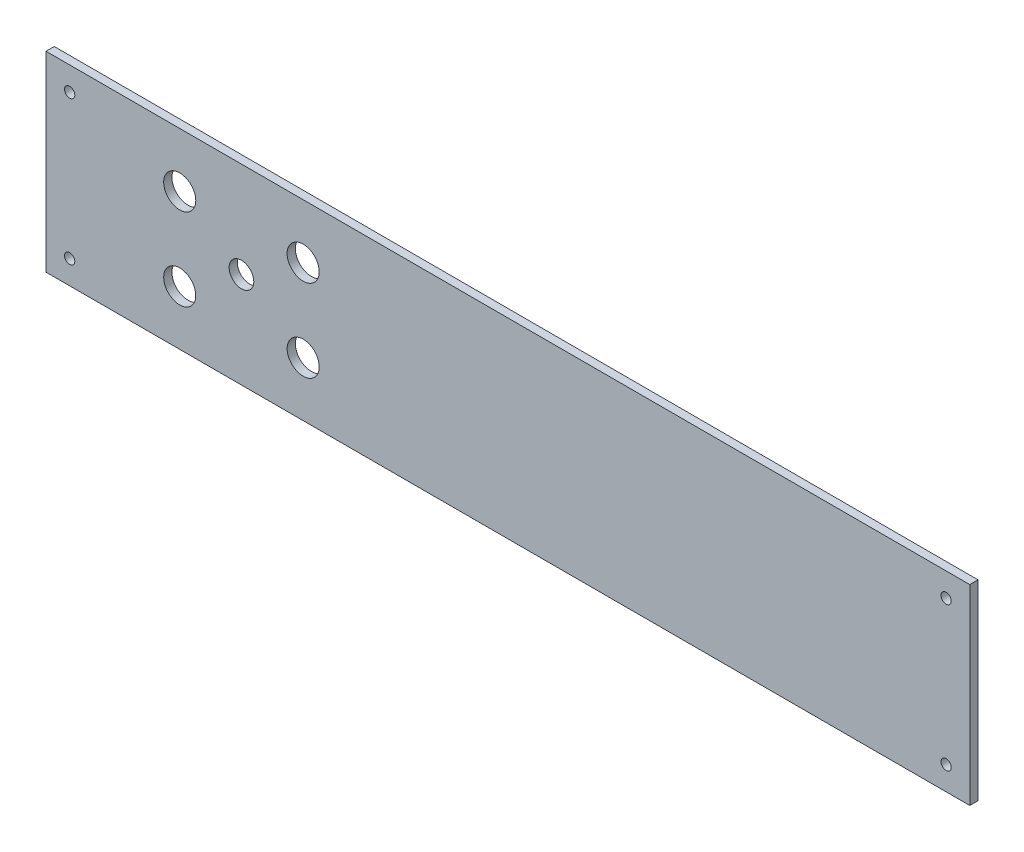
ISO-10303-21;
HEADER;
FILE_DESCRIPTION(('STEP AP214'),'2;1');
FILE_NAME('part.step','',(''),(''),'','','');
FILE_SCHEMA(('AUTOMOTIVE_DESIGN { 1 0 10303 214 1 1 1 1 }'));
ENDSEC;
DATA;
#1=APPLICATION_CONTEXT('core data for automotive mechanical design processes');
#2=APPLICATION_PROTOCOL_DEFINITION('international standard','automotive_design',2000,#1);
#3=PRODUCT_CONTEXT('',#1,'mechanical');
#4=PRODUCT('Part','Part','',(#3));
#5=PRODUCT_RELATED_PRODUCT_CATEGORY('part','',(#4));
#6=PRODUCT_DEFINITION_FORMATION('','',#4);
#7=PRODUCT_DEFINITION_CONTEXT('part definition',#1,'design');
#8=PRODUCT_DEFINITION('design','',#6,#7);
#9=PRODUCT_DEFINITION_SHAPE('','',#8);
#10=(LENGTH_UNIT() NAMED_UNIT(*) SI_UNIT(.MILLI.,.METRE.));
#11=(NAMED_UNIT(*) PLANE_ANGLE_UNIT() SI_UNIT($,.RADIAN.));
#12=(NAMED_UNIT(*) SI_UNIT($,.STERADIAN.) SOLID_ANGLE_UNIT());
#13=UNCERTAINTY_MEASURE_WITH_UNIT(LENGTH_MEASURE(1.E-05),#10,'distance_accuracy_value','');
#14=(GEOMETRIC_REPRESENTATION_CONTEXT(3) GLOBAL_UNCERTAINTY_ASSIGNED_CONTEXT((#13)) GLOBAL_UNIT_ASSIGNED_CONTEXT((#10,
#11,#12)) REPRESENTATION_CONTEXT('',''));
#15=CARTESIAN_POINT('',(0.,0.,0.));
#16=DIRECTION('',(0.,0.,1.));
#17=DIRECTION('',(1.,0.,0.));
#18=AXIS2_PLACEMENT_3D('',#15,#16,#17);
#19=CARTESIAN_POINT('',(0.,0.,4.));
#20=DIRECTION('',(0.,0.,1.));
#21=DIRECTION('',(1.,0.,0.));
#22=AXIS2_PLACEMENT_3D('',#19,#20,#21);
#23=PLANE('',#22);
#24=CARTESIAN_POINT('',(-324.,66.4999999999999,4.));
#25=DIRECTION('',(0.,0.,1.));
#26=DIRECTION('',(-1.,0.,0.));
#27=AXIS2_PLACEMENT_3D('',#24,#25,#26);
#28=CIRCLE('',#27,7.79999999999999);
#29=CARTESIAN_POINT('',(-331.8,66.4999999999999,4.));
#30=VERTEX_POINT('',#29);
#31=EDGE_CURVE('E191',#30,#30,#28,.T.);
#32=ORIENTED_EDGE('',*,*,#31,.F.);
#33=EDGE_LOOP('',(#32));
#34=FACE_BOUND('',#33,.T.);
#35=CARTESIAN_POINT('',(-324.,26.4999999999999,4.));
#36=DIRECTION('',(0.,0.,1.));
#37=DIRECTION('',(1.,0.,0.));
#38=AXIS2_PLACEMENT_3D('',#35,#36,#37);
#39=CIRCLE('',#38,7.79999999999999);
#40=CARTESIAN_POINT('',(-316.2,26.4999999999999,4.));
#41=VERTEX_POINT('',#40);
#42=EDGE_CURVE('E170',#41,#41,#39,.T.);
#43=ORIENTED_EDGE('',*,*,#42,.F.);
#44=EDGE_LOOP('',(#43));
#45=FACE_BOUND('',#44,.T.);
#46=CARTESIAN_POINT('',(-11.5,11.5000000000001,4.));
#47=DIRECTION('',(0.,0.,1.));
#48=DIRECTION('',(1.,0.,0.));
#49=AXIS2_PLACEMENT_3D('',#46,#47,#48);
#50=CIRCLE('',#49,2.50000000000002);
#51=CARTESIAN_POINT('',(-8.99999999999993,11.5000000000001,4.));
#52=VERTEX_POINT('',#51);
#53=EDGE_CURVE('E144',#52,#52,#50,.T.);
#54=ORIENTED_EDGE('',*,*,#53,.F.);
#55=EDGE_LOOP('',(#54));
#56=FACE_BOUND('',#55,.T.);
#57=CARTESIAN_POINT('',(-384.,26.4999999999999,4.));
#58=DIRECTION('',(0.,0.,1.));
#59=DIRECTION('',(-1.,0.,0.));
#60=AXIS2_PLACEMENT_3D('',#57,#58,#59);
#61=CIRCLE('',#60,7.79999999999999);
#62=CARTESIAN_POINT('',(-391.8,26.4999999999999,4.));
#63=VERTEX_POINT('',#62);
#64=EDGE_CURVE('E128',#63,#63,#61,.T.);
#65=ORIENTED_EDGE('',*,*,#64,.F.);
#66=EDGE_LOOP('',(#65));
#67=FACE_BOUND('',#66,.T.);
#68=DIRECTION('',(0.,1.,0.));
#69=VECTOR('',#68,1.);
#70=CARTESIAN_POINT('',(0.,0.,4.));
#71=LINE('',#70,#69);
#72=CARTESIAN_POINT('',(0.,0.,4.));
#73=VERTEX_POINT('',#72);
#74=CARTESIAN_POINT('',(0.,92.9999999999999,4.));
#75=VERTEX_POINT('',#74);
#76=EDGE_CURVE('E92',#73,#75,#71,.T.);
#77=ORIENTED_EDGE('',*,*,#76,.T.);
#78=DIRECTION('',(-1.,0.,0.));
#79=VECTOR('',#78,1.);
#80=CARTESIAN_POINT('',(0.,92.9999999999999,4.));
#81=LINE('',#80,#79);
#82=CARTESIAN_POINT('',(-449.,92.9999999999999,4.));
#83=VERTEX_POINT('',#82);
#84=EDGE_CURVE('E87',#75,#83,#81,.T.);
#85=ORIENTED_EDGE('',*,*,#84,.T.);
#86=DIRECTION('',(0.,-1.,0.));
#87=VECTOR('',#86,1.);
#88=CARTESIAN_POINT('',(-449.,0.,4.));
#89=LINE('',#88,#87);
#90=CARTESIAN_POINT('',(-449.,0.,4.));
#91=VERTEX_POINT('',#90);
#92=EDGE_CURVE('E90',#83,#91,#89,.T.);
#93=ORIENTED_EDGE('',*,*,#92,.T.);
#94=DIRECTION('',(1.,0.,0.));
#95=VECTOR('',#94,1.);
#96=CARTESIAN_POINT('',(0.,0.,4.));
#97=LINE('',#96,#95);
#98=EDGE_CURVE('E57',#91,#73,#97,.T.);
#99=ORIENTED_EDGE('',*,*,#98,.T.);
#100=EDGE_LOOP('',(#77,#85,#93,#99));
#101=FACE_BOUND('',#100,.T.);
#102=CARTESIAN_POINT('',(-437.5,81.4999999999999,4.));
#103=DIRECTION('',(0.,0.,1.));
#104=DIRECTION('',(1.,0.,0.));
#105=AXIS2_PLACEMENT_3D('',#102,#103,#104);
#106=CIRCLE('',#105,2.50000000000002);
#107=CARTESIAN_POINT('',(-435.,81.4999999999999,4.));
#108=VERTEX_POINT('',#107);
#109=EDGE_CURVE('E116',#108,#108,#106,.T.);
#110=ORIENTED_EDGE('',*,*,#109,.F.);
#111=EDGE_LOOP('',(#110));
#112=FACE_BOUND('',#111,.T.);
#113=CARTESIAN_POINT('',(-11.5,81.4999999999998,4.));
#114=DIRECTION('',(0.,0.,1.));
#115=DIRECTION('',(-1.,0.,0.));
#116=AXIS2_PLACEMENT_3D('',#113,#114,#115);
#117=CIRCLE('',#116,2.50000000000002);
#118=CARTESIAN_POINT('',(-14.,81.4999999999998,4.));
#119=VERTEX_POINT('',#118);
#120=EDGE_CURVE('E143',#119,#119,#117,.T.);
#121=ORIENTED_EDGE('',*,*,#120,.F.);
#122=EDGE_LOOP('',(#121));
#123=FACE_BOUND('',#122,.T.);
#124=CARTESIAN_POINT('',(-437.5,11.4999999999999,4.));
#125=DIRECTION('',(0.,0.,1.));
#126=DIRECTION('',(-1.,0.,0.));
#127=AXIS2_PLACEMENT_3D('',#124,#125,#126);
#128=CIRCLE('',#127,2.50000000000002);
#129=CARTESIAN_POINT('',(-440.,11.4999999999999,4.));
#130=VERTEX_POINT('',#129);
#131=EDGE_CURVE('E163',#130,#130,#128,.T.);
#132=ORIENTED_EDGE('',*,*,#131,.F.);
#133=EDGE_LOOP('',(#132));
#134=FACE_BOUND('',#133,.T.);
#135=CARTESIAN_POINT('',(-384.,66.4999999999999,4.));
#136=DIRECTION('',(0.,0.,1.));
#137=DIRECTION('',(1.,0.,0.));
#138=AXIS2_PLACEMENT_3D('',#135,#136,#137);
#139=CIRCLE('',#138,7.79999999999999);
#140=CARTESIAN_POINT('',(-376.2,66.4999999999999,4.));
#141=VERTEX_POINT('',#140);
#142=EDGE_CURVE('E180',#141,#141,#139,.T.);
#143=ORIENTED_EDGE('',*,*,#142,.F.);
#144=EDGE_LOOP('',(#143));
#145=FACE_BOUND('',#144,.T.);
#146=CARTESIAN_POINT('',(-354.,46.4999999999999,4.));
#147=DIRECTION('',(0.,0.,1.));
#148=DIRECTION('',(1.,0.,0.));
#149=AXIS2_PLACEMENT_3D('',#146,#147,#148);
#150=CIRCLE('',#149,5.99999999999999);
#151=CARTESIAN_POINT('',(-348.,46.4999999999999,4.));
#152=VERTEX_POINT('',#151);
#153=EDGE_CURVE('E203',#152,#152,#150,.T.);
#154=ORIENTED_EDGE('',*,*,#153,.F.);
#155=EDGE_LOOP('',(#154));
#156=FACE_BOUND('',#155,.T.);
#157=ADVANCED_FACE('F39',(#34,#45,#56,#67,#101,#112,#123,#134,#145,#156),#23,.T.);
#158=CARTESIAN_POINT('',(0.,0.,0.));
#159=DIRECTION('',(0.,0.,1.));
#160=DIRECTION('',(1.,0.,0.));
#161=AXIS2_PLACEMENT_3D('',#158,#159,#160);
#162=PLANE('',#161);
#163=DIRECTION('',(0.,1.,0.));
#164=VECTOR('',#163,1.);
#165=CARTESIAN_POINT('',(0.,0.,0.));
#166=LINE('',#165,#164);
#167=CARTESIAN_POINT('',(0.,0.,0.));
#168=VERTEX_POINT('',#167);
#169=CARTESIAN_POINT('',(0.,92.9999999999999,0.));
#170=VERTEX_POINT('',#169);
#171=EDGE_CURVE('E121',#168,#170,#166,.T.);
#172=ORIENTED_EDGE('',*,*,#171,.F.);
#173=DIRECTION('',(1.,0.,0.));
#174=VECTOR('',#173,1.);
#175=CARTESIAN_POINT('',(0.,0.,0.));
#176=LINE('',#175,#174);
#177=CARTESIAN_POINT('',(-449.,0.,0.));
#178=VERTEX_POINT('',#177);
#179=EDGE_CURVE('E80',#178,#168,#176,.T.);
#180=ORIENTED_EDGE('',*,*,#179,.F.);
#181=DIRECTION('',(0.,-1.,0.));
#182=VECTOR('',#181,1.);
#183=CARTESIAN_POINT('',(-449.,0.,0.));
#184=LINE('',#183,#182);
#185=CARTESIAN_POINT('',(-449.,92.9999999999999,0.));
#186=VERTEX_POINT('',#185);
#187=EDGE_CURVE('E74',#186,#178,#184,.T.);
#188=ORIENTED_EDGE('',*,*,#187,.F.);
#189=DIRECTION('',(-1.,0.,0.));
#190=VECTOR('',#189,1.);
#191=CARTESIAN_POINT('',(0.,92.9999999999999,0.));
#192=LINE('',#191,#190);
#193=EDGE_CURVE('E96',#170,#186,#192,.T.);
#194=ORIENTED_EDGE('',*,*,#193,.F.);
#195=EDGE_LOOP('',(#172,#180,#188,#194));
#196=FACE_BOUND('',#195,.T.);
#197=CARTESIAN_POINT('',(-437.5,81.4999999999999,0.));
#198=DIRECTION('',(0.,0.,1.));
#199=DIRECTION('',(1.,0.,0.));
#200=AXIS2_PLACEMENT_3D('',#197,#198,#199);
#201=CIRCLE('',#200,2.50000000000002);
#202=CARTESIAN_POINT('',(-435.,81.4999999999999,0.));
#203=VERTEX_POINT('',#202);
#204=EDGE_CURVE('E122',#203,#203,#201,.T.);
#205=ORIENTED_EDGE('',*,*,#204,.T.);
#206=EDGE_LOOP('',(#205));
#207=FACE_BOUND('',#206,.T.);
#208=CARTESIAN_POINT('',(-384.,26.4999999999999,0.));
#209=DIRECTION('',(0.,0.,1.));
#210=DIRECTION('',(-1.,0.,0.));
#211=AXIS2_PLACEMENT_3D('',#208,#209,#210);
#212=CIRCLE('',#211,7.79999999999999);
#213=CARTESIAN_POINT('',(-391.8,26.4999999999999,0.));
#214=VERTEX_POINT('',#213);
#215=EDGE_CURVE('E123',#214,#214,#212,.T.);
#216=ORIENTED_EDGE('',*,*,#215,.T.);
#217=EDGE_LOOP('',(#216));
#218=FACE_BOUND('',#217,.T.);
#219=CARTESIAN_POINT('',(-11.5,81.4999999999998,0.));
#220=DIRECTION('',(0.,0.,1.));
#221=DIRECTION('',(-1.,0.,0.));
#222=AXIS2_PLACEMENT_3D('',#219,#220,#221);
#223=CIRCLE('',#222,2.50000000000002);
#224=CARTESIAN_POINT('',(-14.,81.4999999999998,0.));
#225=VERTEX_POINT('',#224);
#226=EDGE_CURVE('E140',#225,#225,#223,.T.);
#227=ORIENTED_EDGE('',*,*,#226,.T.);
#228=EDGE_LOOP('',(#227));
#229=FACE_BOUND('',#228,.T.);
#230=CARTESIAN_POINT('',(-11.5,11.5000000000001,0.));
#231=DIRECTION('',(0.,0.,1.));
#232=DIRECTION('',(1.,0.,0.));
#233=AXIS2_PLACEMENT_3D('',#230,#231,#232);
#234=CIRCLE('',#233,2.50000000000002);
#235=CARTESIAN_POINT('',(-8.99999999999993,11.5000000000001,0.));
#236=VERTEX_POINT('',#235);
#237=EDGE_CURVE('E157',#236,#236,#234,.T.);
#238=ORIENTED_EDGE('',*,*,#237,.T.);
#239=EDGE_LOOP('',(#238));
#240=FACE_BOUND('',#239,.T.);
#241=CARTESIAN_POINT('',(-437.5,11.4999999999999,0.));
#242=DIRECTION('',(0.,0.,1.));
#243=DIRECTION('',(-1.,0.,0.));
#244=AXIS2_PLACEMENT_3D('',#241,#242,#243);
#245=CIRCLE('',#244,2.50000000000002);
#246=CARTESIAN_POINT('',(-440.,11.4999999999999,0.));
#247=VERTEX_POINT('',#246);
#248=EDGE_CURVE('E158',#247,#247,#245,.T.);
#249=ORIENTED_EDGE('',*,*,#248,.T.);
#250=EDGE_LOOP('',(#249));
#251=FACE_BOUND('',#250,.T.);
#252=CARTESIAN_POINT('',(-324.,26.4999999999999,0.));
#253=DIRECTION('',(0.,0.,1.));
#254=DIRECTION('',(1.,0.,0.));
#255=AXIS2_PLACEMENT_3D('',#252,#253,#254);
#256=CIRCLE('',#255,7.79999999999999);
#257=CARTESIAN_POINT('',(-316.2,26.4999999999999,0.));
#258=VERTEX_POINT('',#257);
#259=EDGE_CURVE('E173',#258,#258,#256,.T.);
#260=ORIENTED_EDGE('',*,*,#259,.T.);
#261=EDGE_LOOP('',(#260));
#262=FACE_BOUND('',#261,.T.);
#263=CARTESIAN_POINT('',(-384.,66.4999999999999,0.));
#264=DIRECTION('',(0.,0.,1.));
#265=DIRECTION('',(1.,0.,0.));
#266=AXIS2_PLACEMENT_3D('',#263,#264,#265);
#267=CIRCLE('',#266,7.79999999999999);
#268=CARTESIAN_POINT('',(-376.2,66.4999999999999,0.));
#269=VERTEX_POINT('',#268);
#270=EDGE_CURVE('E185',#269,#269,#267,.T.);
#271=ORIENTED_EDGE('',*,*,#270,.T.);
#272=EDGE_LOOP('',(#271));
#273=FACE_BOUND('',#272,.T.);
#274=CARTESIAN_POINT('',(-324.,66.4999999999999,0.));
#275=DIRECTION('',(0.,0.,1.));
#276=DIRECTION('',(-1.,0.,0.));
#277=AXIS2_PLACEMENT_3D('',#274,#275,#276);
#278=CIRCLE('',#277,7.79999999999999);
#279=CARTESIAN_POINT('',(-331.8,66.4999999999999,0.));
#280=VERTEX_POINT('',#279);
#281=EDGE_CURVE('E186',#280,#280,#278,.T.);
#282=ORIENTED_EDGE('',*,*,#281,.T.);
#283=EDGE_LOOP('',(#282));
#284=FACE_BOUND('',#283,.T.);
#285=CARTESIAN_POINT('',(-354.,46.4999999999999,0.));
#286=DIRECTION('',(0.,0.,1.));
#287=DIRECTION('',(1.,0.,0.));
#288=AXIS2_PLACEMENT_3D('',#285,#286,#287);
#289=CIRCLE('',#288,5.99999999999999);
#290=CARTESIAN_POINT('',(-348.,46.4999999999999,0.));
#291=VERTEX_POINT('',#290);
#292=EDGE_CURVE('E200',#291,#291,#289,.T.);
#293=ORIENTED_EDGE('',*,*,#292,.T.);
#294=EDGE_LOOP('',(#293));
#295=FACE_BOUND('',#294,.T.);
#296=ADVANCED_FACE('F219',(#196,#207,#218,#229,#240,#251,#262,#273,#284,#295),#162,.F.);
#297=CARTESIAN_POINT('',(0.,0.,4.));
#298=DIRECTION('',(-1.,0.,0.));
#299=DIRECTION('',(0.,0.,1.));
#300=AXIS2_PLACEMENT_3D('',#297,#298,#299);
#301=PLANE('',#300);
#302=ORIENTED_EDGE('',*,*,#171,.T.);
#303=DIRECTION('',(0.,0.,-1.));
#304=VECTOR('',#303,1.);
#305=CARTESIAN_POINT('',(0.,92.9999999999999,4.));
#306=LINE('',#305,#304);
#307=EDGE_CURVE('E12',#75,#170,#306,.T.);
#308=ORIENTED_EDGE('',*,*,#307,.F.);
#309=ORIENTED_EDGE('',*,*,#76,.F.);
#310=DIRECTION('',(0.,0.,-1.));
#311=VECTOR('',#310,1.);
#312=CARTESIAN_POINT('',(0.,0.,4.));
#313=LINE('',#312,#311);
#314=EDGE_CURVE('E100',#73,#168,#313,.T.);
#315=ORIENTED_EDGE('',*,*,#314,.T.);
#316=EDGE_LOOP('',(#302,#308,#309,#315));
#317=FACE_BOUND('',#316,.T.);
#318=ADVANCED_FACE('F41',(#317),#301,.F.);
#319=CARTESIAN_POINT('',(0.,92.9999999999999,4.));
#320=DIRECTION('',(0.,-1.,0.));
#321=DIRECTION('',(1.,0.,0.));
#322=AXIS2_PLACEMENT_3D('',#319,#320,#321);
#323=PLANE('',#322);
#324=ORIENTED_EDGE('',*,*,#193,.T.);
#325=DIRECTION('',(0.,0.,-1.));
#326=VECTOR('',#325,1.);
#327=CARTESIAN_POINT('',(-449.,92.9999999999999,4.));
#328=LINE('',#327,#326);
#329=EDGE_CURVE('E49',#83,#186,#328,.T.);
#330=ORIENTED_EDGE('',*,*,#329,.F.);
#331=ORIENTED_EDGE('',*,*,#84,.F.);
#332=ORIENTED_EDGE('',*,*,#307,.T.);
#333=EDGE_LOOP('',(#324,#330,#331,#332));
#334=FACE_BOUND('',#333,.T.);
#335=ADVANCED_FACE('F95',(#334),#323,.F.);
#336=CARTESIAN_POINT('',(-449.,0.,4.));
#337=DIRECTION('',(1.,0.,0.));
#338=DIRECTION('',(0.,1.,0.));
#339=AXIS2_PLACEMENT_3D('',#336,#337,#338);
#340=PLANE('',#339);
#341=ORIENTED_EDGE('',*,*,#187,.T.);
#342=DIRECTION('',(0.,0.,-1.));
#343=VECTOR('',#342,1.);
#344=CARTESIAN_POINT('',(-449.,0.,4.));
#345=LINE('',#344,#343);
#346=EDGE_CURVE('E97',#91,#178,#345,.T.);
#347=ORIENTED_EDGE('',*,*,#346,.F.);
#348=ORIENTED_EDGE('',*,*,#92,.F.);
#349=ORIENTED_EDGE('',*,*,#329,.T.);
#350=EDGE_LOOP('',(#341,#347,#348,#349));
#351=FACE_BOUND('',#350,.T.);
#352=ADVANCED_FACE('F98',(#351),#340,.F.);
#353=CARTESIAN_POINT('',(0.,0.,4.));
#354=DIRECTION('',(0.,1.,0.));
#355=DIRECTION('',(-1.,0.,0.));
#356=AXIS2_PLACEMENT_3D('',#353,#354,#355);
#357=PLANE('',#356);
#358=ORIENTED_EDGE('',*,*,#179,.T.);
#359=ORIENTED_EDGE('',*,*,#314,.F.);
#360=ORIENTED_EDGE('',*,*,#98,.F.);
#361=ORIENTED_EDGE('',*,*,#346,.T.);
#362=EDGE_LOOP('',(#358,#359,#360,#361));
#363=FACE_BOUND('',#362,.T.);
#364=ADVANCED_FACE('F232',(#363),#357,.F.);
#365=CARTESIAN_POINT('',(-437.5,81.4999999999999,4.));
#366=DIRECTION('',(0.,0.,-1.));
#367=DIRECTION('',(-1.,0.,0.));
#368=AXIS2_PLACEMENT_3D('',#365,#366,#367);
#369=CYLINDRICAL_SURFACE('',#368,2.50000000000002);
#370=ORIENTED_EDGE('',*,*,#109,.T.);
#371=EDGE_LOOP('',(#370));
#372=FACE_BOUND('',#371,.T.);
#373=ORIENTED_EDGE('',*,*,#204,.F.);
#374=EDGE_LOOP('',(#373));
#375=FACE_BOUND('',#374,.T.);
#376=ADVANCED_FACE('F229',(#372,#375),#369,.F.);
#377=CARTESIAN_POINT('',(-384.,26.4999999999999,4.));
#378=DIRECTION('',(0.,0.,-1.));
#379=DIRECTION('',(-1.,0.,0.));
#380=AXIS2_PLACEMENT_3D('',#377,#378,#379);
#381=CYLINDRICAL_SURFACE('',#380,7.79999999999999);
#382=ORIENTED_EDGE('',*,*,#64,.T.);
#383=EDGE_LOOP('',(#382));
#384=FACE_BOUND('',#383,.T.);
#385=ORIENTED_EDGE('',*,*,#215,.F.);
#386=EDGE_LOOP('',(#385));
#387=FACE_BOUND('',#386,.T.);
#388=ADVANCED_FACE('F297',(#384,#387),#381,.F.);
#389=CARTESIAN_POINT('',(-11.5,81.4999999999998,4.));
#390=DIRECTION('',(0.,0.,-1.));
#391=DIRECTION('',(-1.,0.,0.));
#392=AXIS2_PLACEMENT_3D('',#389,#390,#391);
#393=CYLINDRICAL_SURFACE('',#392,2.50000000000002);
#394=ORIENTED_EDGE('',*,*,#120,.T.);
#395=EDGE_LOOP('',(#394));
#396=FACE_BOUND('',#395,.T.);
#397=ORIENTED_EDGE('',*,*,#226,.F.);
#398=EDGE_LOOP('',(#397));
#399=FACE_BOUND('',#398,.T.);
#400=ADVANCED_FACE('F294',(#396,#399),#393,.F.);
#401=CARTESIAN_POINT('',(-11.5,11.5000000000001,4.));
#402=DIRECTION('',(0.,0.,-1.));
#403=DIRECTION('',(-1.,0.,0.));
#404=AXIS2_PLACEMENT_3D('',#401,#402,#403);
#405=CYLINDRICAL_SURFACE('',#404,2.50000000000002);
#406=ORIENTED_EDGE('',*,*,#53,.T.);
#407=EDGE_LOOP('',(#406));
#408=FACE_BOUND('',#407,.T.);
#409=ORIENTED_EDGE('',*,*,#237,.F.);
#410=EDGE_LOOP('',(#409));
#411=FACE_BOUND('',#410,.T.);
#412=ADVANCED_FACE('F291',(#408,#411),#405,.F.);
#413=CARTESIAN_POINT('',(-437.5,11.4999999999999,4.));
#414=DIRECTION('',(0.,0.,-1.));
#415=DIRECTION('',(-1.,0.,0.));
#416=AXIS2_PLACEMENT_3D('',#413,#414,#415);
#417=CYLINDRICAL_SURFACE('',#416,2.50000000000002);
#418=ORIENTED_EDGE('',*,*,#131,.T.);
#419=EDGE_LOOP('',(#418));
#420=FACE_BOUND('',#419,.T.);
#421=ORIENTED_EDGE('',*,*,#248,.F.);
#422=EDGE_LOOP('',(#421));
#423=FACE_BOUND('',#422,.T.);
#424=ADVANCED_FACE('F287',(#420,#423),#417,.F.);
#425=CARTESIAN_POINT('',(-324.,26.4999999999999,4.));
#426=DIRECTION('',(0.,0.,-1.));
#427=DIRECTION('',(-1.,0.,0.));
#428=AXIS2_PLACEMENT_3D('',#425,#426,#427);
#429=CYLINDRICAL_SURFACE('',#428,7.79999999999999);
#430=ORIENTED_EDGE('',*,*,#42,.T.);
#431=EDGE_LOOP('',(#430));
#432=FACE_BOUND('',#431,.T.);
#433=ORIENTED_EDGE('',*,*,#259,.F.);
#434=EDGE_LOOP('',(#433));
#435=FACE_BOUND('',#434,.T.);
#436=ADVANCED_FACE('F283',(#432,#435),#429,.F.);
#437=CARTESIAN_POINT('',(-384.,66.4999999999999,4.));
#438=DIRECTION('',(0.,0.,-1.));
#439=DIRECTION('',(-1.,0.,0.));
#440=AXIS2_PLACEMENT_3D('',#437,#438,#439);
#441=CYLINDRICAL_SURFACE('',#440,7.79999999999999);
#442=ORIENTED_EDGE('',*,*,#142,.T.);
#443=EDGE_LOOP('',(#442));
#444=FACE_BOUND('',#443,.T.);
#445=ORIENTED_EDGE('',*,*,#270,.F.);
#446=EDGE_LOOP('',(#445));
#447=FACE_BOUND('',#446,.T.);
#448=ADVANCED_FACE('F278',(#444,#447),#441,.F.);
#449=CARTESIAN_POINT('',(-324.,66.4999999999999,4.));
#450=DIRECTION('',(0.,0.,-1.));
#451=DIRECTION('',(-1.,0.,0.));
#452=AXIS2_PLACEMENT_3D('',#449,#450,#451);
#453=CYLINDRICAL_SURFACE('',#452,7.79999999999999);
#454=ORIENTED_EDGE('',*,*,#31,.T.);
#455=EDGE_LOOP('',(#454));
#456=FACE_BOUND('',#455,.T.);
#457=ORIENTED_EDGE('',*,*,#281,.F.);
#458=EDGE_LOOP('',(#457));
#459=FACE_BOUND('',#458,.T.);
#460=ADVANCED_FACE('F273',(#456,#459),#453,.F.);
#461=CARTESIAN_POINT('',(-354.,46.4999999999999,4.));
#462=DIRECTION('',(0.,0.,-1.));
#463=DIRECTION('',(-1.,0.,0.));
#464=AXIS2_PLACEMENT_3D('',#461,#462,#463);
#465=CYLINDRICAL_SURFACE('',#464,5.99999999999999);
#466=ORIENTED_EDGE('',*,*,#153,.T.);
#467=EDGE_LOOP('',(#466));
#468=FACE_BOUND('',#467,.T.);
#469=ORIENTED_EDGE('',*,*,#292,.F.);
#470=EDGE_LOOP('',(#469));
#471=FACE_BOUND('',#470,.T.);
#472=ADVANCED_FACE('F215',(#468,#471),#465,.F.);
#473=CLOSED_SHELL('',(#157,#296,#318,#335,#352,#364,#376,#388,#400,#412,#424,#436,#448,#460,#472));
#474=MANIFOLD_SOLID_BREP('B2',#473);
#475=ADVANCED_BREP_SHAPE_REPRESENTATION('',(#18,#474),#14);
#476=SHAPE_DEFINITION_REPRESENTATION(#9,#475);
ENDSEC;
END-ISO-10303-21;
